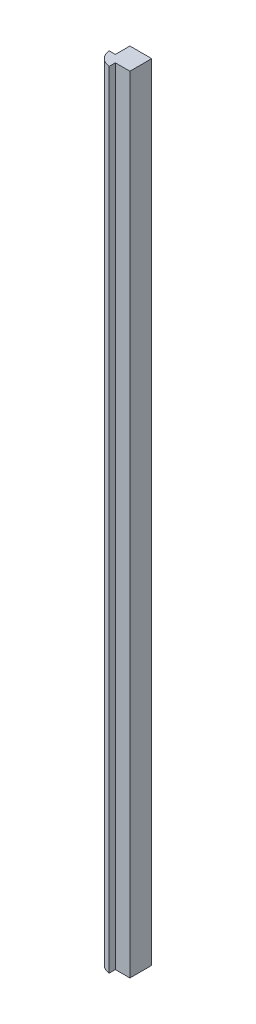
ISO-10303-21;
HEADER;
FILE_DESCRIPTION(('STEP AP214'),'2;1');
FILE_NAME('part.step','',(''),(''),'','','');
FILE_SCHEMA(('AUTOMOTIVE_DESIGN { 1 0 10303 214 1 1 1 1 }'));
ENDSEC;
DATA;
#1=APPLICATION_CONTEXT('core data for automotive mechanical design processes');
#2=APPLICATION_PROTOCOL_DEFINITION('international standard','automotive_design',2000,#1);
#3=PRODUCT_CONTEXT('',#1,'mechanical');
#4=PRODUCT('Part','Part','',(#3));
#5=PRODUCT_RELATED_PRODUCT_CATEGORY('part','',(#4));
#6=PRODUCT_DEFINITION_FORMATION('','',#4);
#7=PRODUCT_DEFINITION_CONTEXT('part definition',#1,'design');
#8=PRODUCT_DEFINITION('design','',#6,#7);
#9=PRODUCT_DEFINITION_SHAPE('','',#8);
#10=(LENGTH_UNIT() NAMED_UNIT(*) SI_UNIT(.MILLI.,.METRE.));
#11=(NAMED_UNIT(*) PLANE_ANGLE_UNIT() SI_UNIT($,.RADIAN.));
#12=(NAMED_UNIT(*) SI_UNIT($,.STERADIAN.) SOLID_ANGLE_UNIT());
#13=UNCERTAINTY_MEASURE_WITH_UNIT(LENGTH_MEASURE(1.E-05),#10,'distance_accuracy_value','');
#14=(GEOMETRIC_REPRESENTATION_CONTEXT(3) GLOBAL_UNCERTAINTY_ASSIGNED_CONTEXT((#13)) GLOBAL_UNIT_ASSIGNED_CONTEXT((#10,
#11,#12)) REPRESENTATION_CONTEXT('',''));
#15=CARTESIAN_POINT('',(0.,0.,0.));
#16=DIRECTION('',(0.,0.,1.));
#17=DIRECTION('',(1.,0.,0.));
#18=AXIS2_PLACEMENT_3D('',#15,#16,#17);
#19=CARTESIAN_POINT('',(12.7,342.9,-3.175));
#20=DIRECTION('',(-1.,0.,0.));
#21=DIRECTION('',(0.,0.,1.));
#22=AXIS2_PLACEMENT_3D('',#19,#20,#21);
#23=PLANE('',#22);
#24=DIRECTION('',(0.,0.,-1.));
#25=VECTOR('',#24,1.);
#26=CARTESIAN_POINT('',(12.7,0.,-3.175));
#27=LINE('',#26,#25);
#28=CARTESIAN_POINT('',(12.7,0.,-3.175));
#29=VERTEX_POINT('',#28);
#30=CARTESIAN_POINT('',(12.7,0.,-12.7));
#31=VERTEX_POINT('',#30);
#32=EDGE_CURVE('E123',#29,#31,#27,.T.);
#33=ORIENTED_EDGE('',*,*,#32,.T.);
#34=DIRECTION('',(0.,-1.,0.));
#35=VECTOR('',#34,1.);
#36=CARTESIAN_POINT('',(12.7,342.9,-12.7));
#37=LINE('',#36,#35);
#38=CARTESIAN_POINT('',(12.7,342.9,-12.7));
#39=VERTEX_POINT('',#38);
#40=EDGE_CURVE('E11',#39,#31,#37,.T.);
#41=ORIENTED_EDGE('',*,*,#40,.F.);
#42=DIRECTION('',(0.,0.,-1.));
#43=VECTOR('',#42,1.);
#44=CARTESIAN_POINT('',(12.7,342.9,-3.175));
#45=LINE('',#44,#43);
#46=CARTESIAN_POINT('',(12.7,342.9,-3.175));
#47=VERTEX_POINT('',#46);
#48=EDGE_CURVE('E135',#47,#39,#45,.T.);
#49=ORIENTED_EDGE('',*,*,#48,.F.);
#50=DIRECTION('',(0.,-1.,0.));
#51=VECTOR('',#50,1.);
#52=CARTESIAN_POINT('',(12.7,342.9,-3.175));
#53=LINE('',#52,#51);
#54=EDGE_CURVE('E119',#47,#29,#53,.T.);
#55=ORIENTED_EDGE('',*,*,#54,.T.);
#56=EDGE_LOOP('',(#33,#41,#49,#55));
#57=FACE_BOUND('',#56,.T.);
#58=ADVANCED_FACE('F33',(#57),#23,.F.);
#59=CARTESIAN_POINT('',(3.175,342.9,-12.7));
#60=DIRECTION('',(0.,0.,1.));
#61=DIRECTION('',(1.,0.,0.));
#62=AXIS2_PLACEMENT_3D('',#59,#60,#61);
#63=PLANE('',#62);
#64=DIRECTION('',(-1.,0.,0.));
#65=VECTOR('',#64,1.);
#66=CARTESIAN_POINT('',(3.175,0.,-12.7));
#67=LINE('',#66,#65);
#68=CARTESIAN_POINT('',(3.175,0.,-12.7));
#69=VERTEX_POINT('',#68);
#70=EDGE_CURVE('E126',#31,#69,#67,.T.);
#71=ORIENTED_EDGE('',*,*,#70,.T.);
#72=DIRECTION('',(0.,-1.,0.));
#73=VECTOR('',#72,1.);
#74=CARTESIAN_POINT('',(3.175,342.9,-12.7));
#75=LINE('',#74,#73);
#76=CARTESIAN_POINT('',(3.175,342.9,-12.7));
#77=VERTEX_POINT('',#76);
#78=EDGE_CURVE('E41',#77,#69,#75,.T.);
#79=ORIENTED_EDGE('',*,*,#78,.F.);
#80=DIRECTION('',(-1.,0.,0.));
#81=VECTOR('',#80,1.);
#82=CARTESIAN_POINT('',(3.175,342.9,-12.7));
#83=LINE('',#82,#81);
#84=EDGE_CURVE('E89',#39,#77,#83,.T.);
#85=ORIENTED_EDGE('',*,*,#84,.F.);
#86=ORIENTED_EDGE('',*,*,#40,.T.);
#87=EDGE_LOOP('',(#71,#79,#85,#86));
#88=FACE_BOUND('',#87,.T.);
#89=ADVANCED_FACE('F160',(#88),#63,.F.);
#90=CARTESIAN_POINT('',(3.175,342.9,-12.7));
#91=DIRECTION('',(1.,0.,0.));
#92=DIRECTION('',(0.,0.,-1.));
#93=AXIS2_PLACEMENT_3D('',#90,#91,#92);
#94=PLANE('',#93);
#95=DIRECTION('',(0.,0.,1.));
#96=VECTOR('',#95,1.);
#97=CARTESIAN_POINT('',(3.175,0.,-12.7));
#98=LINE('',#97,#96);
#99=CARTESIAN_POINT('',(3.175,0.,-6.35));
#100=VERTEX_POINT('',#99);
#101=EDGE_CURVE('E128',#69,#100,#98,.T.);
#102=ORIENTED_EDGE('',*,*,#101,.T.);
#103=DIRECTION('',(0.,-1.,0.));
#104=VECTOR('',#103,1.);
#105=CARTESIAN_POINT('',(3.175,342.9,-6.35));
#106=LINE('',#105,#104);
#107=CARTESIAN_POINT('',(3.175,342.9,-6.35));
#108=VERTEX_POINT('',#107);
#109=EDGE_CURVE('E139',#108,#100,#106,.T.);
#110=ORIENTED_EDGE('',*,*,#109,.F.);
#111=DIRECTION('',(0.,0.,1.));
#112=VECTOR('',#111,1.);
#113=CARTESIAN_POINT('',(3.175,342.9,-12.7));
#114=LINE('',#113,#112);
#115=EDGE_CURVE('E147',#77,#108,#114,.T.);
#116=ORIENTED_EDGE('',*,*,#115,.F.);
#117=ORIENTED_EDGE('',*,*,#78,.T.);
#118=EDGE_LOOP('',(#102,#110,#116,#117));
#119=FACE_BOUND('',#118,.T.);
#120=ADVANCED_FACE('F145',(#119),#94,.F.);
#121=CARTESIAN_POINT('',(0.508000000000009,342.9,-6.35000000000002));
#122=DIRECTION('',(0.,0.,1.));
#123=DIRECTION('',(1.,0.,0.));
#124=AXIS2_PLACEMENT_3D('',#121,#122,#123);
#125=PLANE('',#124);
#126=DIRECTION('',(-1.,0.,0.));
#127=VECTOR('',#126,1.);
#128=CARTESIAN_POINT('',(0.508000000000009,0.,-6.35000000000002));
#129=LINE('',#128,#127);
#130=CARTESIAN_POINT('',(0.508000000000009,0.,-6.35000000000002));
#131=VERTEX_POINT('',#130);
#132=EDGE_CURVE('E130',#100,#131,#129,.T.);
#133=ORIENTED_EDGE('',*,*,#132,.T.);
#134=DIRECTION('',(0.,-1.,0.));
#135=VECTOR('',#134,1.);
#136=CARTESIAN_POINT('',(0.508000000000009,342.9,-6.35000000000002));
#137=LINE('',#136,#135);
#138=CARTESIAN_POINT('',(0.508000000000009,342.9,-6.35000000000002));
#139=VERTEX_POINT('',#138);
#140=EDGE_CURVE('E114',#139,#131,#137,.T.);
#141=ORIENTED_EDGE('',*,*,#140,.F.);
#142=DIRECTION('',(-1.,0.,0.));
#143=VECTOR('',#142,1.);
#144=CARTESIAN_POINT('',(0.508000000000009,342.9,-6.35000000000002));
#145=LINE('',#144,#143);
#146=EDGE_CURVE('E105',#108,#139,#145,.T.);
#147=ORIENTED_EDGE('',*,*,#146,.F.);
#148=ORIENTED_EDGE('',*,*,#109,.T.);
#149=EDGE_LOOP('',(#133,#141,#147,#148));
#150=FACE_BOUND('',#149,.T.);
#151=ADVANCED_FACE('F153',(#150),#125,.F.);
#152=CARTESIAN_POINT('',(6.83913328185279,342.9,-6.83913328185278));
#153=DIRECTION('',(0.,-1.,0.));
#154=DIRECTION('',(0.,0.,-1.));
#155=AXIS2_PLACEMENT_3D('',#152,#153,#154);
#156=CYLINDRICAL_SURFACE('',#155,6.35);
#157=CARTESIAN_POINT('',(6.83913328185279,0.,-6.83913328185278));
#158=DIRECTION('',(0.,1.,0.));
#159=DIRECTION('',(0.,0.,1.));
#160=AXIS2_PLACEMENT_3D('',#157,#158,#159);
#161=CIRCLE('',#160,6.35);
#162=CARTESIAN_POINT('',(6.35000000000002,0.,-0.507999999999999));
#163=VERTEX_POINT('',#162);
#164=EDGE_CURVE('E113',#131,#163,#161,.T.);
#165=ORIENTED_EDGE('',*,*,#164,.T.);
#166=DIRECTION('',(0.,-1.,0.));
#167=VECTOR('',#166,1.);
#168=CARTESIAN_POINT('',(6.35000000000002,342.9,-0.507999999999999));
#169=LINE('',#168,#167);
#170=CARTESIAN_POINT('',(6.35000000000002,342.9,-0.507999999999999));
#171=VERTEX_POINT('',#170);
#172=EDGE_CURVE('E110',#171,#163,#169,.T.);
#173=ORIENTED_EDGE('',*,*,#172,.F.);
#174=CARTESIAN_POINT('',(6.83913328185279,342.9,-6.83913328185278));
#175=DIRECTION('',(0.,1.,0.));
#176=DIRECTION('',(0.,0.,1.));
#177=AXIS2_PLACEMENT_3D('',#174,#175,#176);
#178=CIRCLE('',#177,6.35);
#179=EDGE_CURVE('E99',#139,#171,#178,.T.);
#180=ORIENTED_EDGE('',*,*,#179,.F.);
#181=ORIENTED_EDGE('',*,*,#140,.T.);
#182=EDGE_LOOP('',(#165,#173,#180,#181));
#183=FACE_BOUND('',#182,.T.);
#184=ADVANCED_FACE('F111',(#183),#156,.T.);
#185=CARTESIAN_POINT('',(6.35000000000003,342.9,-0.507999999999999));
#186=DIRECTION('',(-1.,0.,0.));
#187=DIRECTION('',(0.,0.,1.));
#188=AXIS2_PLACEMENT_3D('',#185,#186,#187);
#189=PLANE('',#188);
#190=DIRECTION('',(0.,0.,-1.));
#191=VECTOR('',#190,1.);
#192=CARTESIAN_POINT('',(6.35000000000003,0.,-0.507999999999999));
#193=LINE('',#192,#191);
#194=CARTESIAN_POINT('',(6.35,0.,-3.175));
#195=VERTEX_POINT('',#194);
#196=EDGE_CURVE('E75',#163,#195,#193,.T.);
#197=ORIENTED_EDGE('',*,*,#196,.T.);
#198=DIRECTION('',(0.,-1.,0.));
#199=VECTOR('',#198,1.);
#200=CARTESIAN_POINT('',(6.35,342.9,-3.175));
#201=LINE('',#200,#199);
#202=CARTESIAN_POINT('',(6.35,342.9,-3.175));
#203=VERTEX_POINT('',#202);
#204=EDGE_CURVE('E115',#203,#195,#201,.T.);
#205=ORIENTED_EDGE('',*,*,#204,.F.);
#206=DIRECTION('',(0.,0.,-1.));
#207=VECTOR('',#206,1.);
#208=CARTESIAN_POINT('',(6.35000000000003,342.9,-0.507999999999999));
#209=LINE('',#208,#207);
#210=EDGE_CURVE('E103',#171,#203,#209,.T.);
#211=ORIENTED_EDGE('',*,*,#210,.F.);
#212=ORIENTED_EDGE('',*,*,#172,.T.);
#213=EDGE_LOOP('',(#197,#205,#211,#212));
#214=FACE_BOUND('',#213,.T.);
#215=ADVANCED_FACE('F117',(#214),#189,.F.);
#216=CARTESIAN_POINT('',(12.7,342.9,-3.175));
#217=DIRECTION('',(0.,0.,-1.));
#218=DIRECTION('',(-1.,0.,0.));
#219=AXIS2_PLACEMENT_3D('',#216,#217,#218);
#220=PLANE('',#219);
#221=DIRECTION('',(1.,0.,0.));
#222=VECTOR('',#221,1.);
#223=CARTESIAN_POINT('',(12.7,0.,-3.175));
#224=LINE('',#223,#222);
#225=EDGE_CURVE('E81',#195,#29,#224,.T.);
#226=ORIENTED_EDGE('',*,*,#225,.T.);
#227=ORIENTED_EDGE('',*,*,#54,.F.);
#228=DIRECTION('',(1.,0.,0.));
#229=VECTOR('',#228,1.);
#230=CARTESIAN_POINT('',(12.7,342.9,-3.175));
#231=LINE('',#230,#229);
#232=EDGE_CURVE('E49',#203,#47,#231,.T.);
#233=ORIENTED_EDGE('',*,*,#232,.F.);
#234=ORIENTED_EDGE('',*,*,#204,.T.);
#235=EDGE_LOOP('',(#226,#227,#233,#234));
#236=FACE_BOUND('',#235,.T.);
#237=ADVANCED_FACE('F174',(#236),#220,.F.);
#238=CARTESIAN_POINT('',(6.83913328185279,342.9,-6.83913328185278));
#239=DIRECTION('',(0.,1.,0.));
#240=DIRECTION('',(0.,0.,1.));
#241=AXIS2_PLACEMENT_3D('',#238,#239,#240);
#242=PLANE('',#241);
#243=ORIENTED_EDGE('',*,*,#48,.T.);
#244=ORIENTED_EDGE('',*,*,#84,.T.);
#245=ORIENTED_EDGE('',*,*,#115,.T.);
#246=ORIENTED_EDGE('',*,*,#146,.T.);
#247=ORIENTED_EDGE('',*,*,#179,.T.);
#248=ORIENTED_EDGE('',*,*,#210,.T.);
#249=ORIENTED_EDGE('',*,*,#232,.T.);
#250=EDGE_LOOP('',(#243,#244,#245,#246,#247,#248,#249));
#251=FACE_BOUND('',#250,.T.);
#252=ADVANCED_FACE('F101',(#251),#242,.T.);
#253=CARTESIAN_POINT('',(6.83913328185279,0.,-6.83913328185278));
#254=DIRECTION('',(0.,1.,0.));
#255=DIRECTION('',(0.,0.,1.));
#256=AXIS2_PLACEMENT_3D('',#253,#254,#255);
#257=PLANE('',#256);
#258=ORIENTED_EDGE('',*,*,#32,.F.);
#259=ORIENTED_EDGE('',*,*,#225,.F.);
#260=ORIENTED_EDGE('',*,*,#196,.F.);
#261=ORIENTED_EDGE('',*,*,#164,.F.);
#262=ORIENTED_EDGE('',*,*,#132,.F.);
#263=ORIENTED_EDGE('',*,*,#101,.F.);
#264=ORIENTED_EDGE('',*,*,#70,.F.);
#265=EDGE_LOOP('',(#258,#259,#260,#261,#262,#263,#264));
#266=FACE_BOUND('',#265,.T.);
#267=ADVANCED_FACE('F151',(#266),#257,.F.);
#268=CLOSED_SHELL('',(#58,#89,#120,#151,#184,#215,#237,#252,#267));
#269=MANIFOLD_SOLID_BREP('B2',#268);
#270=ADVANCED_BREP_SHAPE_REPRESENTATION('',(#18,#269),#14);
#271=SHAPE_DEFINITION_REPRESENTATION(#9,#270);
ENDSEC;
END-ISO-10303-21;
